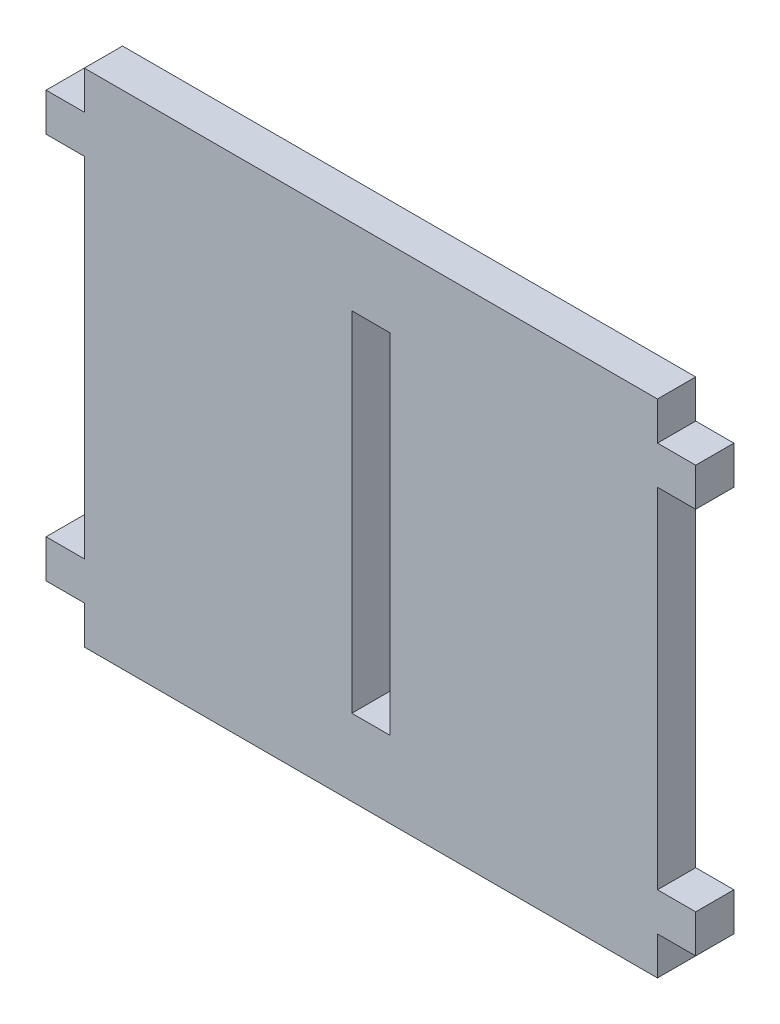
ISO-10303-21;
HEADER;
FILE_DESCRIPTION(('STEP AP214'),'2;1');
FILE_NAME('part.step','',(''),(''),'','','');
FILE_SCHEMA(('AUTOMOTIVE_DESIGN { 1 0 10303 214 1 1 1 1 }'));
ENDSEC;
DATA;
#1=APPLICATION_CONTEXT('core data for automotive mechanical design processes');
#2=APPLICATION_PROTOCOL_DEFINITION('international standard','automotive_design',2000,#1);
#3=PRODUCT_CONTEXT('',#1,'mechanical');
#4=PRODUCT('Part','Part','',(#3));
#5=PRODUCT_RELATED_PRODUCT_CATEGORY('part','',(#4));
#6=PRODUCT_DEFINITION_FORMATION('','',#4);
#7=PRODUCT_DEFINITION_CONTEXT('part definition',#1,'design');
#8=PRODUCT_DEFINITION('design','',#6,#7);
#9=PRODUCT_DEFINITION_SHAPE('','',#8);
#10=(LENGTH_UNIT() NAMED_UNIT(*) SI_UNIT(.MILLI.,.METRE.));
#11=(NAMED_UNIT(*) PLANE_ANGLE_UNIT() SI_UNIT($,.RADIAN.));
#12=(NAMED_UNIT(*) SI_UNIT($,.STERADIAN.) SOLID_ANGLE_UNIT());
#13=UNCERTAINTY_MEASURE_WITH_UNIT(LENGTH_MEASURE(1.E-05),#10,'distance_accuracy_value','');
#14=(GEOMETRIC_REPRESENTATION_CONTEXT(3) GLOBAL_UNCERTAINTY_ASSIGNED_CONTEXT((#13)) GLOBAL_UNIT_ASSIGNED_CONTEXT((#10,
#11,#12)) REPRESENTATION_CONTEXT('',''));
#15=CARTESIAN_POINT('',(0.,0.,0.));
#16=DIRECTION('',(0.,0.,1.));
#17=DIRECTION('',(1.,0.,0.));
#18=AXIS2_PLACEMENT_3D('',#15,#16,#17);
#19=CARTESIAN_POINT('',(0.,0.,6.35));
#20=DIRECTION('',(0.,0.,-1.));
#21=DIRECTION('',(-1.,0.,0.));
#22=AXIS2_PLACEMENT_3D('',#19,#20,#21);
#23=PLANE('',#22);
#24=DIRECTION('',(0.,1.,0.));
#25=VECTOR('',#24,1.);
#26=CARTESIAN_POINT('',(0.,35.3139375,6.35));
#27=LINE('',#26,#25);
#28=CARTESIAN_POINT('',(0.,28.9639375,6.35));
#29=VERTEX_POINT('',#28);
#30=CARTESIAN_POINT('',(0.,35.3139375,6.35));
#31=VERTEX_POINT('',#30);
#32=EDGE_CURVE('E229',#29,#31,#27,.T.);
#33=ORIENTED_EDGE('',*,*,#32,.T.);
#34=DIRECTION('',(-1.,0.,0.));
#35=VECTOR('',#34,1.);
#36=CARTESIAN_POINT('',(0.,35.3139375,6.35));
#37=LINE('',#36,#35);
#38=CARTESIAN_POINT('',(-6.34999999999999,35.3139374999999,6.35));
#39=VERTEX_POINT('',#38);
#40=EDGE_CURVE('E232',#31,#39,#37,.T.);
#41=ORIENTED_EDGE('',*,*,#40,.T.);
#42=DIRECTION('',(0.,1.,0.));
#43=VECTOR('',#42,1.);
#44=CARTESIAN_POINT('',(-6.34999999999999,35.3139374999999,6.35));
#45=LINE('',#44,#43);
#46=CARTESIAN_POINT('',(-6.34999999999999,41.6639375,6.35));
#47=VERTEX_POINT('',#46);
#48=EDGE_CURVE('E235',#39,#47,#45,.T.);
#49=ORIENTED_EDGE('',*,*,#48,.T.);
#50=DIRECTION('',(-1.,0.,0.));
#51=VECTOR('',#50,1.);
#52=CARTESIAN_POINT('',(-6.34999999999999,41.6639375,6.35));
#53=LINE('',#52,#51);
#54=CARTESIAN_POINT('',(-101.6,41.6639375,6.35));
#55=VERTEX_POINT('',#54);
#56=EDGE_CURVE('E237',#47,#55,#53,.T.);
#57=ORIENTED_EDGE('',*,*,#56,.T.);
#58=DIRECTION('',(0.,-1.,0.));
#59=VECTOR('',#58,1.);
#60=CARTESIAN_POINT('',(-101.6,35.3139374999999,6.35));
#61=LINE('',#60,#59);
#62=CARTESIAN_POINT('',(-101.6,35.3139374999999,6.35));
#63=VERTEX_POINT('',#62);
#64=EDGE_CURVE('E239',#55,#63,#61,.T.);
#65=ORIENTED_EDGE('',*,*,#64,.T.);
#66=DIRECTION('',(-1.,0.,0.));
#67=VECTOR('',#66,1.);
#68=CARTESIAN_POINT('',(-101.6,35.3139374999999,6.35));
#69=LINE('',#68,#67);
#70=CARTESIAN_POINT('',(-107.95,35.3139375,6.35));
#71=VERTEX_POINT('',#70);
#72=EDGE_CURVE('E241',#63,#71,#69,.T.);
#73=ORIENTED_EDGE('',*,*,#72,.T.);
#74=DIRECTION('',(0.,-1.,0.));
#75=VECTOR('',#74,1.);
#76=CARTESIAN_POINT('',(-107.95,35.3139375,6.35));
#77=LINE('',#76,#75);
#78=CARTESIAN_POINT('',(-107.95,28.9639375,6.35));
#79=VERTEX_POINT('',#78);
#80=EDGE_CURVE('E243',#71,#79,#77,.T.);
#81=ORIENTED_EDGE('',*,*,#80,.T.);
#82=DIRECTION('',(1.,0.,0.));
#83=VECTOR('',#82,1.);
#84=CARTESIAN_POINT('',(-101.6,28.9639375,6.35));
#85=LINE('',#84,#83);
#86=CARTESIAN_POINT('',(-101.6,28.9639375,6.35));
#87=VERTEX_POINT('',#86);
#88=EDGE_CURVE('E245',#79,#87,#85,.T.);
#89=ORIENTED_EDGE('',*,*,#88,.T.);
#90=DIRECTION('',(0.,-1.,0.));
#91=VECTOR('',#90,1.);
#92=CARTESIAN_POINT('',(-101.6,-28.9639375,6.35));
#93=LINE('',#92,#91);
#94=CARTESIAN_POINT('',(-101.6,-28.9639375,6.35));
#95=VERTEX_POINT('',#94);
#96=EDGE_CURVE('E247',#87,#95,#93,.T.);
#97=ORIENTED_EDGE('',*,*,#96,.T.);
#98=DIRECTION('',(-1.,0.,0.));
#99=VECTOR('',#98,1.);
#100=CARTESIAN_POINT('',(-107.95,-28.9639375,6.35));
#101=LINE('',#100,#99);
#102=CARTESIAN_POINT('',(-107.95,-28.9639375,6.35));
#103=VERTEX_POINT('',#102);
#104=EDGE_CURVE('E249',#95,#103,#101,.T.);
#105=ORIENTED_EDGE('',*,*,#104,.T.);
#106=DIRECTION('',(0.,-1.,0.));
#107=VECTOR('',#106,1.);
#108=CARTESIAN_POINT('',(-107.95,-28.9639375,6.35));
#109=LINE('',#108,#107);
#110=CARTESIAN_POINT('',(-107.95,-35.3139375,6.35));
#111=VERTEX_POINT('',#110);
#112=EDGE_CURVE('E251',#103,#111,#109,.T.);
#113=ORIENTED_EDGE('',*,*,#112,.T.);
#114=DIRECTION('',(1.,0.,0.));
#115=VECTOR('',#114,1.);
#116=CARTESIAN_POINT('',(-101.6,-35.3139375,6.35));
#117=LINE('',#116,#115);
#118=CARTESIAN_POINT('',(-101.6,-35.3139375,6.35));
#119=VERTEX_POINT('',#118);
#120=EDGE_CURVE('E253',#111,#119,#117,.T.);
#121=ORIENTED_EDGE('',*,*,#120,.T.);
#122=DIRECTION('',(0.,-1.,0.));
#123=VECTOR('',#122,1.);
#124=CARTESIAN_POINT('',(-101.6,-35.3139375,6.35));
#125=LINE('',#124,#123);
#126=CARTESIAN_POINT('',(-101.6,-41.6639375,6.35));
#127=VERTEX_POINT('',#126);
#128=EDGE_CURVE('E255',#119,#127,#125,.T.);
#129=ORIENTED_EDGE('',*,*,#128,.T.);
#130=DIRECTION('',(1.,0.,0.));
#131=VECTOR('',#130,1.);
#132=CARTESIAN_POINT('',(-6.34999999999998,-41.6639375,6.35));
#133=LINE('',#132,#131);
#134=CARTESIAN_POINT('',(-6.34999999999998,-41.6639375,6.35));
#135=VERTEX_POINT('',#134);
#136=EDGE_CURVE('E257',#127,#135,#133,.T.);
#137=ORIENTED_EDGE('',*,*,#136,.T.);
#138=DIRECTION('',(0.,1.,0.));
#139=VECTOR('',#138,1.);
#140=CARTESIAN_POINT('',(-6.34999999999998,-35.3139375,6.35));
#141=LINE('',#140,#139);
#142=CARTESIAN_POINT('',(-6.34999999999998,-35.3139375,6.35));
#143=VERTEX_POINT('',#142);
#144=EDGE_CURVE('E259',#135,#143,#141,.T.);
#145=ORIENTED_EDGE('',*,*,#144,.T.);
#146=DIRECTION('',(1.,0.,0.));
#147=VECTOR('',#146,1.);
#148=CARTESIAN_POINT('',(0.,-35.3139375,6.35));
#149=LINE('',#148,#147);
#150=CARTESIAN_POINT('',(0.,-35.3139375,6.35));
#151=VERTEX_POINT('',#150);
#152=EDGE_CURVE('E261',#143,#151,#149,.T.);
#153=ORIENTED_EDGE('',*,*,#152,.T.);
#154=DIRECTION('',(0.,1.,0.));
#155=VECTOR('',#154,1.);
#156=CARTESIAN_POINT('',(0.,-28.9639375,6.35));
#157=LINE('',#156,#155);
#158=CARTESIAN_POINT('',(0.,-28.9639375,6.35));
#159=VERTEX_POINT('',#158);
#160=EDGE_CURVE('E263',#151,#159,#157,.T.);
#161=ORIENTED_EDGE('',*,*,#160,.T.);
#162=DIRECTION('',(-1.,0.,0.));
#163=VECTOR('',#162,1.);
#164=CARTESIAN_POINT('',(-6.34999999999998,-28.9639375,6.35));
#165=LINE('',#164,#163);
#166=CARTESIAN_POINT('',(-6.34999999999998,-28.9639375,6.35));
#167=VERTEX_POINT('',#166);
#168=EDGE_CURVE('E265',#159,#167,#165,.T.);
#169=ORIENTED_EDGE('',*,*,#168,.T.);
#170=DIRECTION('',(0.,1.,0.));
#171=VECTOR('',#170,1.);
#172=CARTESIAN_POINT('',(-6.34999999999999,28.9639375,6.35));
#173=LINE('',#172,#171);
#174=CARTESIAN_POINT('',(-6.34999999999999,28.9639375,6.35));
#175=VERTEX_POINT('',#174);
#176=EDGE_CURVE('E267',#167,#175,#173,.T.);
#177=ORIENTED_EDGE('',*,*,#176,.T.);
#178=DIRECTION('',(1.,0.,0.));
#179=VECTOR('',#178,1.);
#180=CARTESIAN_POINT('',(0.,28.9639375,6.35));
#181=LINE('',#180,#179);
#182=EDGE_CURVE('E269',#175,#29,#181,.T.);
#183=ORIENTED_EDGE('',*,*,#182,.T.);
#184=EDGE_LOOP('',(#33,#41,#49,#57,#65,#73,#81,#89,#97,#105,#113,#121,#129,#137,#145,#153,#161,
#169,#177,#183));
#185=FACE_BOUND('',#184,.T.);
#186=DIRECTION('',(-1.,0.,0.));
#187=VECTOR('',#186,1.);
#188=CARTESIAN_POINT('',(-50.8,28.9639375,6.35));
#189=LINE('',#188,#187);
#190=CARTESIAN_POINT('',(-50.8,28.9639375,6.35));
#191=VERTEX_POINT('',#190);
#192=CARTESIAN_POINT('',(-57.15,28.9639375,6.35));
#193=VERTEX_POINT('',#192);
#194=EDGE_CURVE('E193',#191,#193,#189,.T.);
#195=ORIENTED_EDGE('',*,*,#194,.F.);
#196=DIRECTION('',(0.,1.,0.));
#197=VECTOR('',#196,1.);
#198=CARTESIAN_POINT('',(-50.8,-28.9639375,6.35));
#199=LINE('',#198,#197);
#200=CARTESIAN_POINT('',(-50.8,-28.9639375,6.35));
#201=VERTEX_POINT('',#200);
#202=EDGE_CURVE('E215',#201,#191,#199,.T.);
#203=ORIENTED_EDGE('',*,*,#202,.F.);
#204=DIRECTION('',(1.,0.,0.));
#205=VECTOR('',#204,1.);
#206=CARTESIAN_POINT('',(-57.15,-28.9639375,6.35));
#207=LINE('',#206,#205);
#208=CARTESIAN_POINT('',(-57.15,-28.9639375,6.35));
#209=VERTEX_POINT('',#208);
#210=EDGE_CURVE('E213',#209,#201,#207,.T.);
#211=ORIENTED_EDGE('',*,*,#210,.F.);
#212=DIRECTION('',(0.,-1.,0.));
#213=VECTOR('',#212,1.);
#214=CARTESIAN_POINT('',(-57.15,28.9639375,6.35));
#215=LINE('',#214,#213);
#216=EDGE_CURVE('E201',#193,#209,#215,.T.);
#217=ORIENTED_EDGE('',*,*,#216,.F.);
#218=EDGE_LOOP('',(#195,#203,#211,#217));
#219=FACE_BOUND('',#218,.T.);
#220=ADVANCED_FACE('F32',(#185,#219),#23,.F.);
#221=CARTESIAN_POINT('',(0.,0.,0.));
#222=DIRECTION('',(0.,0.,-1.));
#223=DIRECTION('',(-1.,0.,0.));
#224=AXIS2_PLACEMENT_3D('',#221,#222,#223);
#225=PLANE('',#224);
#226=DIRECTION('',(0.,1.,0.));
#227=VECTOR('',#226,1.);
#228=CARTESIAN_POINT('',(0.,35.3139375,0.));
#229=LINE('',#228,#227);
#230=CARTESIAN_POINT('',(0.,28.9639375,0.));
#231=VERTEX_POINT('',#230);
#232=CARTESIAN_POINT('',(0.,35.3139375,0.));
#233=VERTEX_POINT('',#232);
#234=EDGE_CURVE('E209',#231,#233,#229,.T.);
#235=ORIENTED_EDGE('',*,*,#234,.F.);
#236=DIRECTION('',(1.,0.,0.));
#237=VECTOR('',#236,1.);
#238=CARTESIAN_POINT('',(0.,28.9639375,0.));
#239=LINE('',#238,#237);
#240=CARTESIAN_POINT('',(-6.34999999999999,28.9639375,0.));
#241=VERTEX_POINT('',#240);
#242=EDGE_CURVE('E233',#241,#231,#239,.T.);
#243=ORIENTED_EDGE('',*,*,#242,.F.);
#244=DIRECTION('',(0.,1.,0.));
#245=VECTOR('',#244,1.);
#246=CARTESIAN_POINT('',(-6.34999999999999,28.9639375,0.));
#247=LINE('',#246,#245);
#248=CARTESIAN_POINT('',(-6.34999999999998,-28.9639375,0.));
#249=VERTEX_POINT('',#248);
#250=EDGE_CURVE('E308',#249,#241,#247,.T.);
#251=ORIENTED_EDGE('',*,*,#250,.F.);
#252=DIRECTION('',(-1.,0.,0.));
#253=VECTOR('',#252,1.);
#254=CARTESIAN_POINT('',(-6.34999999999998,-28.9639375,0.));
#255=LINE('',#254,#253);
#256=CARTESIAN_POINT('',(0.,-28.9639375,0.));
#257=VERTEX_POINT('',#256);
#258=EDGE_CURVE('E306',#257,#249,#255,.T.);
#259=ORIENTED_EDGE('',*,*,#258,.F.);
#260=DIRECTION('',(0.,1.,0.));
#261=VECTOR('',#260,1.);
#262=CARTESIAN_POINT('',(0.,-28.9639375,0.));
#263=LINE('',#262,#261);
#264=CARTESIAN_POINT('',(0.,-35.3139375,0.));
#265=VERTEX_POINT('',#264);
#266=EDGE_CURVE('E304',#265,#257,#263,.T.);
#267=ORIENTED_EDGE('',*,*,#266,.F.);
#268=DIRECTION('',(1.,0.,0.));
#269=VECTOR('',#268,1.);
#270=CARTESIAN_POINT('',(0.,-35.3139375,0.));
#271=LINE('',#270,#269);
#272=CARTESIAN_POINT('',(-6.34999999999998,-35.3139375,0.));
#273=VERTEX_POINT('',#272);
#274=EDGE_CURVE('E302',#273,#265,#271,.T.);
#275=ORIENTED_EDGE('',*,*,#274,.F.);
#276=DIRECTION('',(0.,1.,0.));
#277=VECTOR('',#276,1.);
#278=CARTESIAN_POINT('',(-6.34999999999998,-35.3139375,0.));
#279=LINE('',#278,#277);
#280=CARTESIAN_POINT('',(-6.34999999999998,-41.6639375,0.));
#281=VERTEX_POINT('',#280);
#282=EDGE_CURVE('E300',#281,#273,#279,.T.);
#283=ORIENTED_EDGE('',*,*,#282,.F.);
#284=DIRECTION('',(1.,0.,0.));
#285=VECTOR('',#284,1.);
#286=CARTESIAN_POINT('',(-6.34999999999998,-41.6639375,0.));
#287=LINE('',#286,#285);
#288=CARTESIAN_POINT('',(-101.6,-41.6639375,0.));
#289=VERTEX_POINT('',#288);
#290=EDGE_CURVE('E298',#289,#281,#287,.T.);
#291=ORIENTED_EDGE('',*,*,#290,.F.);
#292=DIRECTION('',(0.,-1.,0.));
#293=VECTOR('',#292,1.);
#294=CARTESIAN_POINT('',(-101.6,-35.3139375,0.));
#295=LINE('',#294,#293);
#296=CARTESIAN_POINT('',(-101.6,-35.3139375,0.));
#297=VERTEX_POINT('',#296);
#298=EDGE_CURVE('E296',#297,#289,#295,.T.);
#299=ORIENTED_EDGE('',*,*,#298,.F.);
#300=DIRECTION('',(1.,0.,0.));
#301=VECTOR('',#300,1.);
#302=CARTESIAN_POINT('',(-101.6,-35.3139375,0.));
#303=LINE('',#302,#301);
#304=CARTESIAN_POINT('',(-107.95,-35.3139375,0.));
#305=VERTEX_POINT('',#304);
#306=EDGE_CURVE('E294',#305,#297,#303,.T.);
#307=ORIENTED_EDGE('',*,*,#306,.F.);
#308=DIRECTION('',(0.,-1.,0.));
#309=VECTOR('',#308,1.);
#310=CARTESIAN_POINT('',(-107.95,-28.9639375,0.));
#311=LINE('',#310,#309);
#312=CARTESIAN_POINT('',(-107.95,-28.9639375,0.));
#313=VERTEX_POINT('',#312);
#314=EDGE_CURVE('E292',#313,#305,#311,.T.);
#315=ORIENTED_EDGE('',*,*,#314,.F.);
#316=DIRECTION('',(-1.,0.,0.));
#317=VECTOR('',#316,1.);
#318=CARTESIAN_POINT('',(-107.95,-28.9639375,0.));
#319=LINE('',#318,#317);
#320=CARTESIAN_POINT('',(-101.6,-28.9639375,0.));
#321=VERTEX_POINT('',#320);
#322=EDGE_CURVE('E290',#321,#313,#319,.T.);
#323=ORIENTED_EDGE('',*,*,#322,.F.);
#324=DIRECTION('',(0.,-1.,0.));
#325=VECTOR('',#324,1.);
#326=CARTESIAN_POINT('',(-101.6,-28.9639375,0.));
#327=LINE('',#326,#325);
#328=CARTESIAN_POINT('',(-101.6,28.9639375,0.));
#329=VERTEX_POINT('',#328);
#330=EDGE_CURVE('E288',#329,#321,#327,.T.);
#331=ORIENTED_EDGE('',*,*,#330,.F.);
#332=DIRECTION('',(1.,0.,0.));
#333=VECTOR('',#332,1.);
#334=CARTESIAN_POINT('',(-101.6,28.9639375,0.));
#335=LINE('',#334,#333);
#336=CARTESIAN_POINT('',(-107.95,28.9639375,0.));
#337=VERTEX_POINT('',#336);
#338=EDGE_CURVE('E286',#337,#329,#335,.T.);
#339=ORIENTED_EDGE('',*,*,#338,.F.);
#340=DIRECTION('',(0.,-1.,0.));
#341=VECTOR('',#340,1.);
#342=CARTESIAN_POINT('',(-107.95,35.3139375,0.));
#343=LINE('',#342,#341);
#344=CARTESIAN_POINT('',(-107.95,35.3139375,0.));
#345=VERTEX_POINT('',#344);
#346=EDGE_CURVE('E284',#345,#337,#343,.T.);
#347=ORIENTED_EDGE('',*,*,#346,.F.);
#348=DIRECTION('',(-1.,0.,0.));
#349=VECTOR('',#348,1.);
#350=CARTESIAN_POINT('',(-101.6,35.3139374999999,0.));
#351=LINE('',#350,#349);
#352=CARTESIAN_POINT('',(-101.6,35.3139374999999,0.));
#353=VERTEX_POINT('',#352);
#354=EDGE_CURVE('E282',#353,#345,#351,.T.);
#355=ORIENTED_EDGE('',*,*,#354,.F.);
#356=DIRECTION('',(0.,-1.,0.));
#357=VECTOR('',#356,1.);
#358=CARTESIAN_POINT('',(-101.6,35.3139374999999,0.));
#359=LINE('',#358,#357);
#360=CARTESIAN_POINT('',(-101.6,41.6639375,0.));
#361=VERTEX_POINT('',#360);
#362=EDGE_CURVE('E280',#361,#353,#359,.T.);
#363=ORIENTED_EDGE('',*,*,#362,.F.);
#364=DIRECTION('',(-1.,0.,0.));
#365=VECTOR('',#364,1.);
#366=CARTESIAN_POINT('',(-6.34999999999999,41.6639375,0.));
#367=LINE('',#366,#365);
#368=CARTESIAN_POINT('',(-6.34999999999999,41.6639375,0.));
#369=VERTEX_POINT('',#368);
#370=EDGE_CURVE('E278',#369,#361,#367,.T.);
#371=ORIENTED_EDGE('',*,*,#370,.F.);
#372=DIRECTION('',(0.,1.,0.));
#373=VECTOR('',#372,1.);
#374=CARTESIAN_POINT('',(-6.34999999999999,35.3139374999999,0.));
#375=LINE('',#374,#373);
#376=CARTESIAN_POINT('',(-6.34999999999999,35.3139374999999,0.));
#377=VERTEX_POINT('',#376);
#378=EDGE_CURVE('E276',#377,#369,#375,.T.);
#379=ORIENTED_EDGE('',*,*,#378,.F.);
#380=DIRECTION('',(-1.,0.,0.));
#381=VECTOR('',#380,1.);
#382=CARTESIAN_POINT('',(0.,35.3139375,0.));
#383=LINE('',#382,#381);
#384=EDGE_CURVE('E274',#233,#377,#383,.T.);
#385=ORIENTED_EDGE('',*,*,#384,.F.);
#386=EDGE_LOOP('',(#235,#243,#251,#259,#267,#275,#283,#291,#299,#307,#315,#323,#331,#339,#347,
#355,#363,#371,#379,#385));
#387=FACE_BOUND('',#386,.T.);
#388=DIRECTION('',(0.,1.,0.));
#389=VECTOR('',#388,1.);
#390=CARTESIAN_POINT('',(-50.8,-28.9639375,0.));
#391=LINE('',#390,#389);
#392=CARTESIAN_POINT('',(-50.8,-28.9639375,0.));
#393=VERTEX_POINT('',#392);
#394=CARTESIAN_POINT('',(-50.8,28.9639375,0.));
#395=VERTEX_POINT('',#394);
#396=EDGE_CURVE('E202',#393,#395,#391,.T.);
#397=ORIENTED_EDGE('',*,*,#396,.T.);
#398=DIRECTION('',(-1.,0.,0.));
#399=VECTOR('',#398,1.);
#400=CARTESIAN_POINT('',(-50.8,28.9639375,0.));
#401=LINE('',#400,#399);
#402=CARTESIAN_POINT('',(-57.15,28.9639375,0.));
#403=VERTEX_POINT('',#402);
#404=EDGE_CURVE('E55',#395,#403,#401,.T.);
#405=ORIENTED_EDGE('',*,*,#404,.T.);
#406=DIRECTION('',(0.,-1.,0.));
#407=VECTOR('',#406,1.);
#408=CARTESIAN_POINT('',(-57.15,28.9639375,0.));
#409=LINE('',#408,#407);
#410=CARTESIAN_POINT('',(-57.15,-28.9639375,0.));
#411=VERTEX_POINT('',#410);
#412=EDGE_CURVE('E208',#403,#411,#409,.T.);
#413=ORIENTED_EDGE('',*,*,#412,.T.);
#414=DIRECTION('',(1.,0.,0.));
#415=VECTOR('',#414,1.);
#416=CARTESIAN_POINT('',(-57.15,-28.9639375,0.));
#417=LINE('',#416,#415);
#418=EDGE_CURVE('E221',#411,#393,#417,.T.);
#419=ORIENTED_EDGE('',*,*,#418,.T.);
#420=EDGE_LOOP('',(#397,#405,#413,#419));
#421=FACE_BOUND('',#420,.T.);
#422=ADVANCED_FACE('F374',(#387,#421),#225,.T.);
#423=CARTESIAN_POINT('',(0.,35.3139375,6.35));
#424=DIRECTION('',(-1.,0.,0.));
#425=DIRECTION('',(0.,-1.,0.));
#426=AXIS2_PLACEMENT_3D('',#423,#424,#425);
#427=PLANE('',#426);
#428=ORIENTED_EDGE('',*,*,#234,.T.);
#429=DIRECTION('',(0.,0.,-1.));
#430=VECTOR('',#429,1.);
#431=CARTESIAN_POINT('',(0.,35.3139375,6.35));
#432=LINE('',#431,#430);
#433=EDGE_CURVE('E11',#31,#233,#432,.T.);
#434=ORIENTED_EDGE('',*,*,#433,.F.);
#435=ORIENTED_EDGE('',*,*,#32,.F.);
#436=DIRECTION('',(0.,0.,-1.));
#437=VECTOR('',#436,1.);
#438=CARTESIAN_POINT('',(0.,28.9639375,6.35));
#439=LINE('',#438,#437);
#440=EDGE_CURVE('E271',#29,#231,#439,.T.);
#441=ORIENTED_EDGE('',*,*,#440,.T.);
#442=EDGE_LOOP('',(#428,#434,#435,#441));
#443=FACE_BOUND('',#442,.T.);
#444=ADVANCED_FACE('F34',(#443),#427,.F.);
#445=CARTESIAN_POINT('',(0.,35.3139375,6.35));
#446=DIRECTION('',(0.,-1.,0.));
#447=DIRECTION('',(1.,0.,0.));
#448=AXIS2_PLACEMENT_3D('',#445,#446,#447);
#449=PLANE('',#448);
#450=ORIENTED_EDGE('',*,*,#384,.T.);
#451=DIRECTION('',(0.,0.,-1.));
#452=VECTOR('',#451,1.);
#453=CARTESIAN_POINT('',(-6.34999999999999,35.3139374999999,6.35));
#454=LINE('',#453,#452);
#455=EDGE_CURVE('E40',#39,#377,#454,.T.);
#456=ORIENTED_EDGE('',*,*,#455,.F.);
#457=ORIENTED_EDGE('',*,*,#40,.F.);
#458=ORIENTED_EDGE('',*,*,#433,.T.);
#459=EDGE_LOOP('',(#450,#456,#457,#458));
#460=FACE_BOUND('',#459,.T.);
#461=ADVANCED_FACE('F391',(#460),#449,.F.);
#462=CARTESIAN_POINT('',(-6.34999999999999,35.3139374999999,6.35));
#463=DIRECTION('',(-1.,0.,0.));
#464=DIRECTION('',(0.,0.,1.));
#465=AXIS2_PLACEMENT_3D('',#462,#463,#464);
#466=PLANE('',#465);
#467=ORIENTED_EDGE('',*,*,#378,.T.);
#468=DIRECTION('',(0.,0.,-1.));
#469=VECTOR('',#468,1.);
#470=CARTESIAN_POINT('',(-6.34999999999999,41.6639375,6.35));
#471=LINE('',#470,#469);
#472=EDGE_CURVE('E361',#47,#369,#471,.T.);
#473=ORIENTED_EDGE('',*,*,#472,.F.);
#474=ORIENTED_EDGE('',*,*,#48,.F.);
#475=ORIENTED_EDGE('',*,*,#455,.T.);
#476=EDGE_LOOP('',(#467,#473,#474,#475));
#477=FACE_BOUND('',#476,.T.);
#478=ADVANCED_FACE('F368',(#477),#466,.F.);
#479=CARTESIAN_POINT('',(-6.34999999999999,41.6639375,6.35));
#480=DIRECTION('',(0.,-1.,0.));
#481=DIRECTION('',(0.,0.,-1.));
#482=AXIS2_PLACEMENT_3D('',#479,#480,#481);
#483=PLANE('',#482);
#484=ORIENTED_EDGE('',*,*,#370,.T.);
#485=DIRECTION('',(0.,0.,-1.));
#486=VECTOR('',#485,1.);
#487=CARTESIAN_POINT('',(-101.6,41.6639375,6.35));
#488=LINE('',#487,#486);
#489=EDGE_CURVE('E358',#55,#361,#488,.T.);
#490=ORIENTED_EDGE('',*,*,#489,.F.);
#491=ORIENTED_EDGE('',*,*,#56,.F.);
#492=ORIENTED_EDGE('',*,*,#472,.T.);
#493=EDGE_LOOP('',(#484,#490,#491,#492));
#494=FACE_BOUND('',#493,.T.);
#495=ADVANCED_FACE('F380',(#494),#483,.F.);
#496=CARTESIAN_POINT('',(-101.6,35.3139374999999,6.35));
#497=DIRECTION('',(1.,0.,0.));
#498=DIRECTION('',(0.,0.,-1.));
#499=AXIS2_PLACEMENT_3D('',#496,#497,#498);
#500=PLANE('',#499);
#501=ORIENTED_EDGE('',*,*,#362,.T.);
#502=DIRECTION('',(0.,0.,-1.));
#503=VECTOR('',#502,1.);
#504=CARTESIAN_POINT('',(-101.6,35.3139374999999,6.35));
#505=LINE('',#504,#503);
#506=EDGE_CURVE('E355',#63,#353,#505,.T.);
#507=ORIENTED_EDGE('',*,*,#506,.F.);
#508=ORIENTED_EDGE('',*,*,#64,.F.);
#509=ORIENTED_EDGE('',*,*,#489,.T.);
#510=EDGE_LOOP('',(#501,#507,#508,#509));
#511=FACE_BOUND('',#510,.T.);
#512=ADVANCED_FACE('F384',(#511),#500,.F.);
#513=CARTESIAN_POINT('',(-101.6,35.3139374999999,6.35));
#514=DIRECTION('',(0.,-1.,0.));
#515=DIRECTION('',(1.,0.,0.));
#516=AXIS2_PLACEMENT_3D('',#513,#514,#515);
#517=PLANE('',#516);
#518=ORIENTED_EDGE('',*,*,#354,.T.);
#519=DIRECTION('',(0.,0.,-1.));
#520=VECTOR('',#519,1.);
#521=CARTESIAN_POINT('',(-107.95,35.3139375,6.35));
#522=LINE('',#521,#520);
#523=EDGE_CURVE('E352',#71,#345,#522,.T.);
#524=ORIENTED_EDGE('',*,*,#523,.F.);
#525=ORIENTED_EDGE('',*,*,#72,.F.);
#526=ORIENTED_EDGE('',*,*,#506,.T.);
#527=EDGE_LOOP('',(#518,#524,#525,#526));
#528=FACE_BOUND('',#527,.T.);
#529=ADVANCED_FACE('F464',(#528),#517,.F.);
#530=CARTESIAN_POINT('',(-107.95,35.3139375,6.35));
#531=DIRECTION('',(1.,0.,0.));
#532=DIRECTION('',(0.,1.,0.));
#533=AXIS2_PLACEMENT_3D('',#530,#531,#532);
#534=PLANE('',#533);
#535=ORIENTED_EDGE('',*,*,#346,.T.);
#536=DIRECTION('',(0.,0.,-1.));
#537=VECTOR('',#536,1.);
#538=CARTESIAN_POINT('',(-107.95,28.9639375,6.35));
#539=LINE('',#538,#537);
#540=EDGE_CURVE('E349',#79,#337,#539,.T.);
#541=ORIENTED_EDGE('',*,*,#540,.F.);
#542=ORIENTED_EDGE('',*,*,#80,.F.);
#543=ORIENTED_EDGE('',*,*,#523,.T.);
#544=EDGE_LOOP('',(#535,#541,#542,#543));
#545=FACE_BOUND('',#544,.T.);
#546=ADVANCED_FACE('F462',(#545),#534,.F.);
#547=CARTESIAN_POINT('',(-101.6,28.9639375,6.35));
#548=DIRECTION('',(0.,1.,0.));
#549=DIRECTION('',(0.,0.,1.));
#550=AXIS2_PLACEMENT_3D('',#547,#548,#549);
#551=PLANE('',#550);
#552=ORIENTED_EDGE('',*,*,#338,.T.);
#553=DIRECTION('',(0.,0.,-1.));
#554=VECTOR('',#553,1.);
#555=CARTESIAN_POINT('',(-101.6,28.9639375,6.35));
#556=LINE('',#555,#554);
#557=EDGE_CURVE('E346',#87,#329,#556,.T.);
#558=ORIENTED_EDGE('',*,*,#557,.F.);
#559=ORIENTED_EDGE('',*,*,#88,.F.);
#560=ORIENTED_EDGE('',*,*,#540,.T.);
#561=EDGE_LOOP('',(#552,#558,#559,#560));
#562=FACE_BOUND('',#561,.T.);
#563=ADVANCED_FACE('F457',(#562),#551,.F.);
#564=CARTESIAN_POINT('',(-101.6,-28.9639375,6.35));
#565=DIRECTION('',(1.,0.,0.));
#566=DIRECTION('',(0.,0.,-1.));
#567=AXIS2_PLACEMENT_3D('',#564,#565,#566);
#568=PLANE('',#567);
#569=ORIENTED_EDGE('',*,*,#330,.T.);
#570=DIRECTION('',(0.,0.,-1.));
#571=VECTOR('',#570,1.);
#572=CARTESIAN_POINT('',(-101.6,-28.9639375,6.35));
#573=LINE('',#572,#571);
#574=EDGE_CURVE('E343',#95,#321,#573,.T.);
#575=ORIENTED_EDGE('',*,*,#574,.F.);
#576=ORIENTED_EDGE('',*,*,#96,.F.);
#577=ORIENTED_EDGE('',*,*,#557,.T.);
#578=EDGE_LOOP('',(#569,#575,#576,#577));
#579=FACE_BOUND('',#578,.T.);
#580=ADVANCED_FACE('F452',(#579),#568,.F.);
#581=CARTESIAN_POINT('',(-107.95,-28.9639375,6.35));
#582=DIRECTION('',(0.,-1.,0.));
#583=DIRECTION('',(0.,0.,-1.));
#584=AXIS2_PLACEMENT_3D('',#581,#582,#583);
#585=PLANE('',#584);
#586=ORIENTED_EDGE('',*,*,#322,.T.);
#587=DIRECTION('',(0.,0.,-1.));
#588=VECTOR('',#587,1.);
#589=CARTESIAN_POINT('',(-107.95,-28.9639375,6.35));
#590=LINE('',#589,#588);
#591=EDGE_CURVE('E340',#103,#313,#590,.T.);
#592=ORIENTED_EDGE('',*,*,#591,.F.);
#593=ORIENTED_EDGE('',*,*,#104,.F.);
#594=ORIENTED_EDGE('',*,*,#574,.T.);
#595=EDGE_LOOP('',(#586,#592,#593,#594));
#596=FACE_BOUND('',#595,.T.);
#597=ADVANCED_FACE('F448',(#596),#585,.F.);
#598=CARTESIAN_POINT('',(-107.95,-28.9639375,6.35));
#599=DIRECTION('',(1.,0.,0.));
#600=DIRECTION('',(0.,0.,-1.));
#601=AXIS2_PLACEMENT_3D('',#598,#599,#600);
#602=PLANE('',#601);
#603=ORIENTED_EDGE('',*,*,#314,.T.);
#604=DIRECTION('',(0.,0.,-1.));
#605=VECTOR('',#604,1.);
#606=CARTESIAN_POINT('',(-107.95,-35.3139375,6.35));
#607=LINE('',#606,#605);
#608=EDGE_CURVE('E337',#111,#305,#607,.T.);
#609=ORIENTED_EDGE('',*,*,#608,.F.);
#610=ORIENTED_EDGE('',*,*,#112,.F.);
#611=ORIENTED_EDGE('',*,*,#591,.T.);
#612=EDGE_LOOP('',(#603,#609,#610,#611));
#613=FACE_BOUND('',#612,.T.);
#614=ADVANCED_FACE('F443',(#613),#602,.F.);
#615=CARTESIAN_POINT('',(-101.6,-35.3139375,6.35));
#616=DIRECTION('',(0.,1.,0.));
#617=DIRECTION('',(-1.,0.,0.));
#618=AXIS2_PLACEMENT_3D('',#615,#616,#617);
#619=PLANE('',#618);
#620=ORIENTED_EDGE('',*,*,#306,.T.);
#621=DIRECTION('',(0.,0.,-1.));
#622=VECTOR('',#621,1.);
#623=CARTESIAN_POINT('',(-101.6,-35.3139375,6.35));
#624=LINE('',#623,#622);
#625=EDGE_CURVE('E334',#119,#297,#624,.T.);
#626=ORIENTED_EDGE('',*,*,#625,.F.);
#627=ORIENTED_EDGE('',*,*,#120,.F.);
#628=ORIENTED_EDGE('',*,*,#608,.T.);
#629=EDGE_LOOP('',(#620,#626,#627,#628));
#630=FACE_BOUND('',#629,.T.);
#631=ADVANCED_FACE('F437',(#630),#619,.F.);
#632=CARTESIAN_POINT('',(-101.6,-35.3139375,6.35));
#633=DIRECTION('',(1.,0.,0.));
#634=DIRECTION('',(0.,0.,-1.));
#635=AXIS2_PLACEMENT_3D('',#632,#633,#634);
#636=PLANE('',#635);
#637=ORIENTED_EDGE('',*,*,#298,.T.);
#638=DIRECTION('',(0.,0.,-1.));
#639=VECTOR('',#638,1.);
#640=CARTESIAN_POINT('',(-101.6,-41.6639375,6.35));
#641=LINE('',#640,#639);
#642=EDGE_CURVE('E331',#127,#289,#641,.T.);
#643=ORIENTED_EDGE('',*,*,#642,.F.);
#644=ORIENTED_EDGE('',*,*,#128,.F.);
#645=ORIENTED_EDGE('',*,*,#625,.T.);
#646=EDGE_LOOP('',(#637,#643,#644,#645));
#647=FACE_BOUND('',#646,.T.);
#648=ADVANCED_FACE('F433',(#647),#636,.F.);
#649=CARTESIAN_POINT('',(-6.34999999999998,-41.6639375,6.35));
#650=DIRECTION('',(0.,1.,0.));
#651=DIRECTION('',(0.,0.,1.));
#652=AXIS2_PLACEMENT_3D('',#649,#650,#651);
#653=PLANE('',#652);
#654=ORIENTED_EDGE('',*,*,#290,.T.);
#655=DIRECTION('',(0.,0.,-1.));
#656=VECTOR('',#655,1.);
#657=CARTESIAN_POINT('',(-6.34999999999998,-41.6639375,6.35));
#658=LINE('',#657,#656);
#659=EDGE_CURVE('E328',#135,#281,#658,.T.);
#660=ORIENTED_EDGE('',*,*,#659,.F.);
#661=ORIENTED_EDGE('',*,*,#136,.F.);
#662=ORIENTED_EDGE('',*,*,#642,.T.);
#663=EDGE_LOOP('',(#654,#660,#661,#662));
#664=FACE_BOUND('',#663,.T.);
#665=ADVANCED_FACE('F428',(#664),#653,.F.);
#666=CARTESIAN_POINT('',(-6.34999999999998,-35.3139375,6.35));
#667=DIRECTION('',(-1.,0.,0.));
#668=DIRECTION('',(0.,0.,1.));
#669=AXIS2_PLACEMENT_3D('',#666,#667,#668);
#670=PLANE('',#669);
#671=ORIENTED_EDGE('',*,*,#282,.T.);
#672=DIRECTION('',(0.,0.,-1.));
#673=VECTOR('',#672,1.);
#674=CARTESIAN_POINT('',(-6.34999999999998,-35.3139375,6.35));
#675=LINE('',#674,#673);
#676=EDGE_CURVE('E325',#143,#273,#675,.T.);
#677=ORIENTED_EDGE('',*,*,#676,.F.);
#678=ORIENTED_EDGE('',*,*,#144,.F.);
#679=ORIENTED_EDGE('',*,*,#659,.T.);
#680=EDGE_LOOP('',(#671,#677,#678,#679));
#681=FACE_BOUND('',#680,.T.);
#682=ADVANCED_FACE('F422',(#681),#670,.F.);
#683=CARTESIAN_POINT('',(0.,-35.3139375,6.35));
#684=DIRECTION('',(0.,1.,0.));
#685=DIRECTION('',(-1.,0.,0.));
#686=AXIS2_PLACEMENT_3D('',#683,#684,#685);
#687=PLANE('',#686);
#688=ORIENTED_EDGE('',*,*,#274,.T.);
#689=DIRECTION('',(0.,0.,-1.));
#690=VECTOR('',#689,1.);
#691=CARTESIAN_POINT('',(0.,-35.3139375,6.35));
#692=LINE('',#691,#690);
#693=EDGE_CURVE('E322',#151,#265,#692,.T.);
#694=ORIENTED_EDGE('',*,*,#693,.F.);
#695=ORIENTED_EDGE('',*,*,#152,.F.);
#696=ORIENTED_EDGE('',*,*,#676,.T.);
#697=EDGE_LOOP('',(#688,#694,#695,#696));
#698=FACE_BOUND('',#697,.T.);
#699=ADVANCED_FACE('F418',(#698),#687,.F.);
#700=CARTESIAN_POINT('',(0.,-28.9639375,6.35));
#701=DIRECTION('',(-1.,0.,0.));
#702=DIRECTION('',(0.,-1.,0.));
#703=AXIS2_PLACEMENT_3D('',#700,#701,#702);
#704=PLANE('',#703);
#705=ORIENTED_EDGE('',*,*,#266,.T.);
#706=DIRECTION('',(0.,0.,-1.));
#707=VECTOR('',#706,1.);
#708=CARTESIAN_POINT('',(0.,-28.9639375,6.35));
#709=LINE('',#708,#707);
#710=EDGE_CURVE('E319',#159,#257,#709,.T.);
#711=ORIENTED_EDGE('',*,*,#710,.F.);
#712=ORIENTED_EDGE('',*,*,#160,.F.);
#713=ORIENTED_EDGE('',*,*,#693,.T.);
#714=EDGE_LOOP('',(#705,#711,#712,#713));
#715=FACE_BOUND('',#714,.T.);
#716=ADVANCED_FACE('F413',(#715),#704,.F.);
#717=CARTESIAN_POINT('',(-6.34999999999998,-28.9639375,6.35));
#718=DIRECTION('',(0.,-1.,0.));
#719=DIRECTION('',(0.,0.,-1.));
#720=AXIS2_PLACEMENT_3D('',#717,#718,#719);
#721=PLANE('',#720);
#722=ORIENTED_EDGE('',*,*,#258,.T.);
#723=DIRECTION('',(0.,0.,-1.));
#724=VECTOR('',#723,1.);
#725=CARTESIAN_POINT('',(-6.34999999999998,-28.9639375,6.35));
#726=LINE('',#725,#724);
#727=EDGE_CURVE('E316',#167,#249,#726,.T.);
#728=ORIENTED_EDGE('',*,*,#727,.F.);
#729=ORIENTED_EDGE('',*,*,#168,.F.);
#730=ORIENTED_EDGE('',*,*,#710,.T.);
#731=EDGE_LOOP('',(#722,#728,#729,#730));
#732=FACE_BOUND('',#731,.T.);
#733=ADVANCED_FACE('F407',(#732),#721,.F.);
#734=CARTESIAN_POINT('',(-6.34999999999999,28.9639375,6.35));
#735=DIRECTION('',(-1.,0.,0.));
#736=DIRECTION('',(0.,-1.,0.));
#737=AXIS2_PLACEMENT_3D('',#734,#735,#736);
#738=PLANE('',#737);
#739=ORIENTED_EDGE('',*,*,#250,.T.);
#740=DIRECTION('',(0.,0.,-1.));
#741=VECTOR('',#740,1.);
#742=CARTESIAN_POINT('',(-6.34999999999999,28.9639375,6.35));
#743=LINE('',#742,#741);
#744=EDGE_CURVE('E313',#175,#241,#743,.T.);
#745=ORIENTED_EDGE('',*,*,#744,.F.);
#746=ORIENTED_EDGE('',*,*,#176,.F.);
#747=ORIENTED_EDGE('',*,*,#727,.T.);
#748=EDGE_LOOP('',(#739,#745,#746,#747));
#749=FACE_BOUND('',#748,.T.);
#750=ADVANCED_FACE('F403',(#749),#738,.F.);
#751=CARTESIAN_POINT('',(0.,28.9639375,6.35));
#752=DIRECTION('',(0.,1.,0.));
#753=DIRECTION('',(0.,0.,1.));
#754=AXIS2_PLACEMENT_3D('',#751,#752,#753);
#755=PLANE('',#754);
#756=ORIENTED_EDGE('',*,*,#242,.T.);
#757=ORIENTED_EDGE('',*,*,#440,.F.);
#758=ORIENTED_EDGE('',*,*,#182,.F.);
#759=ORIENTED_EDGE('',*,*,#744,.T.);
#760=EDGE_LOOP('',(#756,#757,#758,#759));
#761=FACE_BOUND('',#760,.T.);
#762=ADVANCED_FACE('F398',(#761),#755,.F.);
#763=CARTESIAN_POINT('',(-50.8,28.9639375,6.35));
#764=DIRECTION('',(0.,-1.,0.));
#765=DIRECTION('',(0.,0.,-1.));
#766=AXIS2_PLACEMENT_3D('',#763,#764,#765);
#767=PLANE('',#766);
#768=ORIENTED_EDGE('',*,*,#404,.F.);
#769=DIRECTION('',(0.,0.,-1.));
#770=VECTOR('',#769,1.);
#771=CARTESIAN_POINT('',(-50.8,28.9639375,6.35));
#772=LINE('',#771,#770);
#773=EDGE_CURVE('E197',#191,#395,#772,.T.);
#774=ORIENTED_EDGE('',*,*,#773,.F.);
#775=ORIENTED_EDGE('',*,*,#194,.T.);
#776=DIRECTION('',(0.,0.,-1.));
#777=VECTOR('',#776,1.);
#778=CARTESIAN_POINT('',(-57.15,28.9639375,6.35));
#779=LINE('',#778,#777);
#780=EDGE_CURVE('E196',#193,#403,#779,.T.);
#781=ORIENTED_EDGE('',*,*,#780,.T.);
#782=EDGE_LOOP('',(#768,#774,#775,#781));
#783=FACE_BOUND('',#782,.T.);
#784=ADVANCED_FACE('F195',(#783),#767,.T.);
#785=CARTESIAN_POINT('',(-57.15,28.9639375,6.35));
#786=DIRECTION('',(1.,0.,0.));
#787=DIRECTION('',(0.,1.,0.));
#788=AXIS2_PLACEMENT_3D('',#785,#786,#787);
#789=PLANE('',#788);
#790=ORIENTED_EDGE('',*,*,#412,.F.);
#791=ORIENTED_EDGE('',*,*,#780,.F.);
#792=ORIENTED_EDGE('',*,*,#216,.T.);
#793=DIRECTION('',(0.,0.,-1.));
#794=VECTOR('',#793,1.);
#795=CARTESIAN_POINT('',(-57.15,-28.9639375,6.35));
#796=LINE('',#795,#794);
#797=EDGE_CURVE('E210',#209,#411,#796,.T.);
#798=ORIENTED_EDGE('',*,*,#797,.T.);
#799=EDGE_LOOP('',(#790,#791,#792,#798));
#800=FACE_BOUND('',#799,.T.);
#801=ADVANCED_FACE('F205',(#800),#789,.T.);
#802=CARTESIAN_POINT('',(-57.15,-28.9639375,6.35));
#803=DIRECTION('',(0.,1.,0.));
#804=DIRECTION('',(0.,0.,1.));
#805=AXIS2_PLACEMENT_3D('',#802,#803,#804);
#806=PLANE('',#805);
#807=ORIENTED_EDGE('',*,*,#418,.F.);
#808=ORIENTED_EDGE('',*,*,#797,.F.);
#809=ORIENTED_EDGE('',*,*,#210,.T.);
#810=DIRECTION('',(0.,0.,-1.));
#811=VECTOR('',#810,1.);
#812=CARTESIAN_POINT('',(-50.8,-28.9639375,6.35));
#813=LINE('',#812,#811);
#814=EDGE_CURVE('E47',#201,#393,#813,.T.);
#815=ORIENTED_EDGE('',*,*,#814,.T.);
#816=EDGE_LOOP('',(#807,#808,#809,#815));
#817=FACE_BOUND('',#816,.T.);
#818=ADVANCED_FACE('F570',(#817),#806,.T.);
#819=CARTESIAN_POINT('',(-50.8,-28.9639375,6.35));
#820=DIRECTION('',(-1.,0.,0.));
#821=DIRECTION('',(0.,0.,1.));
#822=AXIS2_PLACEMENT_3D('',#819,#820,#821);
#823=PLANE('',#822);
#824=ORIENTED_EDGE('',*,*,#396,.F.);
#825=ORIENTED_EDGE('',*,*,#814,.F.);
#826=ORIENTED_EDGE('',*,*,#202,.T.);
#827=ORIENTED_EDGE('',*,*,#773,.T.);
#828=EDGE_LOOP('',(#824,#825,#826,#827));
#829=FACE_BOUND('',#828,.T.);
#830=ADVANCED_FACE('F576',(#829),#823,.T.);
#831=CLOSED_SHELL('',(#220,#422,#444,#461,#478,#495,#512,#529,#546,#563,#580,#597,#614,#631,
#648,#665,#682,#699,#716,#733,#750,#762,#784,#801,#818,#830));
#832=MANIFOLD_SOLID_BREP('B2',#831);
#833=ADVANCED_BREP_SHAPE_REPRESENTATION('',(#18,#832),#14);
#834=SHAPE_DEFINITION_REPRESENTATION(#9,#833);
ENDSEC;
END-ISO-10303-21;
